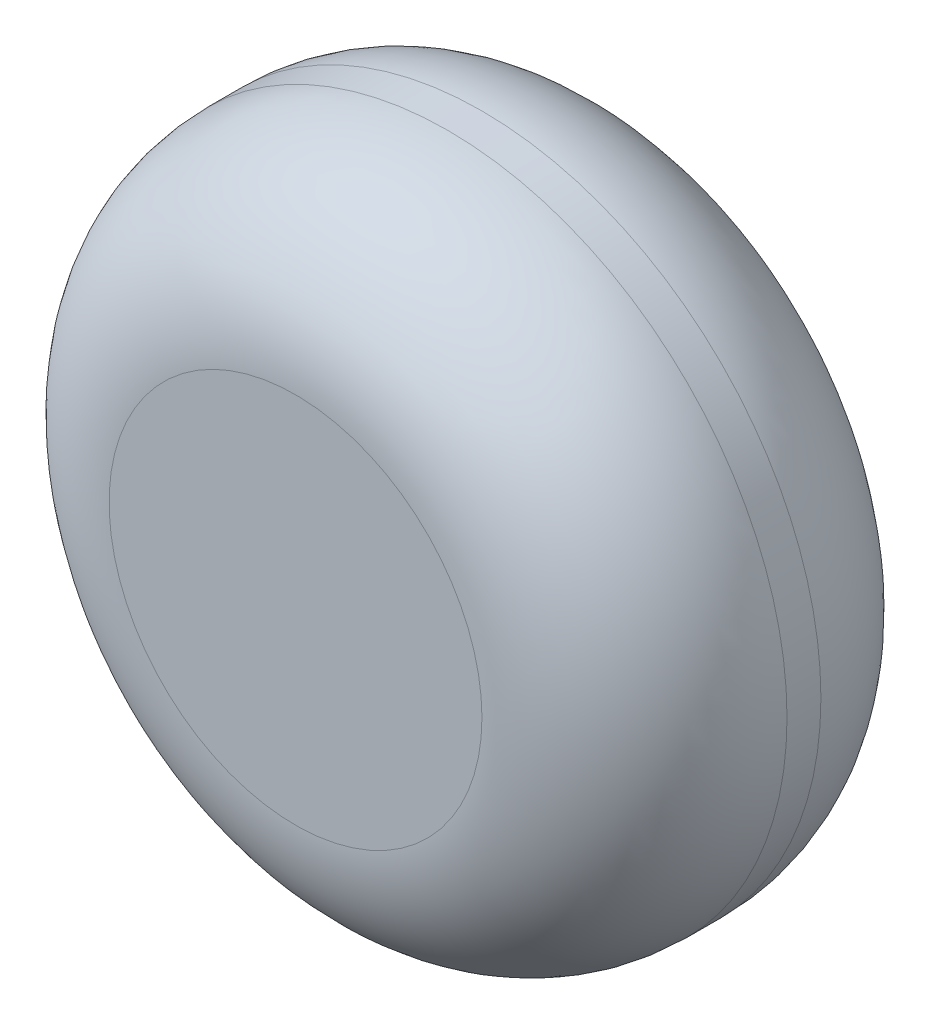
ISO-10303-21;
HEADER;
FILE_DESCRIPTION(('STEP AP214'),'2;1');
FILE_NAME('part.step','',(''),(''),'','','');
FILE_SCHEMA(('AUTOMOTIVE_DESIGN { 1 0 10303 214 1 1 1 1 }'));
ENDSEC;
DATA;
#1=APPLICATION_CONTEXT('core data for automotive mechanical design processes');
#2=APPLICATION_PROTOCOL_DEFINITION('international standard','automotive_design',2000,#1);
#3=PRODUCT_CONTEXT('',#1,'mechanical');
#4=PRODUCT('Part','Part','',(#3));
#5=PRODUCT_RELATED_PRODUCT_CATEGORY('part','',(#4));
#6=PRODUCT_DEFINITION_FORMATION('','',#4);
#7=PRODUCT_DEFINITION_CONTEXT('part definition',#1,'design');
#8=PRODUCT_DEFINITION('design','',#6,#7);
#9=PRODUCT_DEFINITION_SHAPE('','',#8);
#10=(LENGTH_UNIT() NAMED_UNIT(*) SI_UNIT(.MILLI.,.METRE.));
#11=(NAMED_UNIT(*) PLANE_ANGLE_UNIT() SI_UNIT($,.RADIAN.));
#12=(NAMED_UNIT(*) SI_UNIT($,.STERADIAN.) SOLID_ANGLE_UNIT());
#13=UNCERTAINTY_MEASURE_WITH_UNIT(LENGTH_MEASURE(1.E-05),#10,'distance_accuracy_value','');
#14=(GEOMETRIC_REPRESENTATION_CONTEXT(3) GLOBAL_UNCERTAINTY_ASSIGNED_CONTEXT((#13)) GLOBAL_UNIT_ASSIGNED_CONTEXT((#10,
#11,#12)) REPRESENTATION_CONTEXT('',''));
#15=CARTESIAN_POINT('',(0.,0.,0.));
#16=DIRECTION('',(0.,0.,1.));
#17=DIRECTION('',(1.,0.,0.));
#18=AXIS2_PLACEMENT_3D('',#15,#16,#17);
#19=CARTESIAN_POINT('',(0.,0.,50.));
#20=DIRECTION('',(0.,0.,-1.));
#21=DIRECTION('',(-1.,0.,0.));
#22=AXIS2_PLACEMENT_3D('',#19,#20,#21);
#23=CYLINDRICAL_SURFACE('',#22,100.);
#24=CARTESIAN_POINT('',(0.,0.,-5.));
#25=DIRECTION('',(0.,0.,1.));
#26=DIRECTION('',(1.,0.,0.));
#27=AXIS2_PLACEMENT_3D('',#24,#25,#26);
#28=CIRCLE('',#27,100.);
#29=CARTESIAN_POINT('',(100.,0.,-5.));
#30=VERTEX_POINT('',#29);
#31=EDGE_CURVE('E50',#30,#30,#28,.T.);
#32=ORIENTED_EDGE('',*,*,#31,.T.);
#33=EDGE_LOOP('',(#32));
#34=FACE_BOUND('',#33,.T.);
#35=CARTESIAN_POINT('',(0.,0.,5.));
#36=DIRECTION('',(0.,0.,1.));
#37=DIRECTION('',(1.,0.,0.));
#38=AXIS2_PLACEMENT_3D('',#35,#36,#37);
#39=CIRCLE('',#38,100.);
#40=CARTESIAN_POINT('',(100.,0.,5.));
#41=VERTEX_POINT('',#40);
#42=EDGE_CURVE('E55',#41,#41,#39,.F.);
#43=ORIENTED_EDGE('',*,*,#42,.T.);
#44=EDGE_LOOP('',(#43));
#45=FACE_BOUND('',#44,.T.);
#46=ADVANCED_FACE('F37',(#34,#45),#23,.T.);
#47=CARTESIAN_POINT('',(0.,0.,50.));
#48=DIRECTION('',(0.,0.,1.));
#49=DIRECTION('',(1.,0.,0.));
#50=AXIS2_PLACEMENT_3D('',#47,#48,#49);
#51=PLANE('',#50);
#52=CARTESIAN_POINT('',(0.,0.,50.));
#53=DIRECTION('',(0.,0.,1.));
#54=DIRECTION('',(1.,0.,0.));
#55=AXIS2_PLACEMENT_3D('',#52,#53,#54);
#56=CIRCLE('',#55,55.);
#57=CARTESIAN_POINT('',(55.,0.,50.));
#58=VERTEX_POINT('',#57);
#59=EDGE_CURVE('E10',#58,#58,#56,.T.);
#60=ORIENTED_EDGE('',*,*,#59,.T.);
#61=EDGE_LOOP('',(#60));
#62=FACE_BOUND('',#61,.T.);
#63=ADVANCED_FACE('F72',(#62),#51,.T.);
#64=CARTESIAN_POINT('',(0.,0.,-50.));
#65=DIRECTION('',(0.,0.,1.));
#66=DIRECTION('',(1.,0.,0.));
#67=AXIS2_PLACEMENT_3D('',#64,#65,#66);
#68=PLANE('',#67);
#69=CARTESIAN_POINT('',(0.,0.,-50.));
#70=DIRECTION('',(0.,0.,1.));
#71=DIRECTION('',(1.,0.,0.));
#72=AXIS2_PLACEMENT_3D('',#69,#70,#71);
#73=CIRCLE('',#72,55.);
#74=CARTESIAN_POINT('',(55.,0.,-50.));
#75=VERTEX_POINT('',#74);
#76=EDGE_CURVE('E45',#75,#75,#73,.F.);
#77=ORIENTED_EDGE('',*,*,#76,.T.);
#78=EDGE_LOOP('',(#77));
#79=FACE_BOUND('',#78,.T.);
#80=ADVANCED_FACE('F69',(#79),#68,.F.);
#81=CARTESIAN_POINT('',(0.,0.,-5.));
#82=DIRECTION('',(0.,0.,1.));
#83=DIRECTION('',(1.,0.,0.));
#84=AXIS2_PLACEMENT_3D('',#81,#82,#83);
#85=TOROIDAL_SURFACE('',#84,55.,45.);
#86=ORIENTED_EDGE('',*,*,#76,.F.);
#87=EDGE_LOOP('',(#86));
#88=FACE_BOUND('',#87,.T.);
#89=ORIENTED_EDGE('',*,*,#31,.F.);
#90=EDGE_LOOP('',(#89));
#91=FACE_BOUND('',#90,.T.);
#92=ADVANCED_FACE('F65',(#88,#91),#85,.T.);
#93=CARTESIAN_POINT('',(0.,0.,5.));
#94=DIRECTION('',(0.,0.,1.));
#95=DIRECTION('',(1.,0.,0.));
#96=AXIS2_PLACEMENT_3D('',#93,#94,#95);
#97=TOROIDAL_SURFACE('',#96,55.,45.);
#98=ORIENTED_EDGE('',*,*,#42,.F.);
#99=EDGE_LOOP('',(#98));
#100=FACE_BOUND('',#99,.T.);
#101=ORIENTED_EDGE('',*,*,#59,.F.);
#102=EDGE_LOOP('',(#101));
#103=FACE_BOUND('',#102,.T.);
#104=ADVANCED_FACE('F39',(#100,#103),#97,.T.);
#105=CLOSED_SHELL('',(#46,#63,#80,#92,#104));
#106=MANIFOLD_SOLID_BREP('B2',#105);
#107=ADVANCED_BREP_SHAPE_REPRESENTATION('',(#18,#106),#14);
#108=SHAPE_DEFINITION_REPRESENTATION(#9,#107);
ENDSEC;
END-ISO-10303-21;
